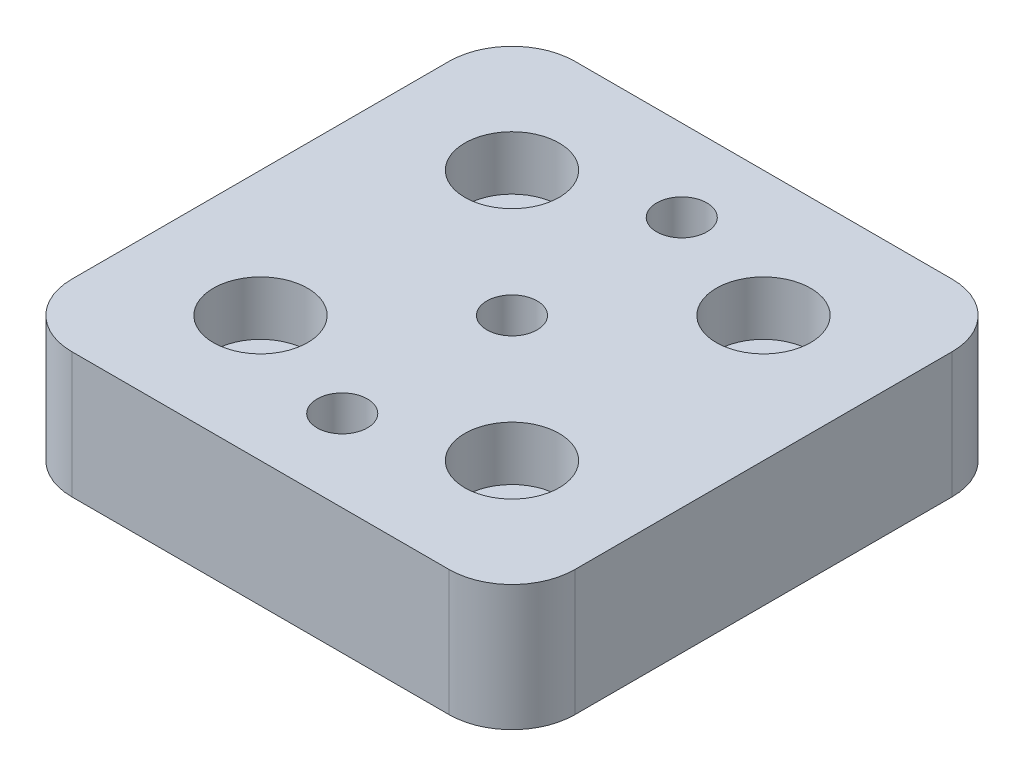
ISO-10303-21;
HEADER;
FILE_DESCRIPTION(('STEP AP214'),'2;1');
FILE_NAME('part.step','',(''),(''),'','','');
FILE_SCHEMA(('AUTOMOTIVE_DESIGN { 1 0 10303 214 1 1 1 1 }'));
ENDSEC;
DATA;
#1=APPLICATION_CONTEXT('core data for automotive mechanical design processes');
#2=APPLICATION_PROTOCOL_DEFINITION('international standard','automotive_design',2000,#1);
#3=PRODUCT_CONTEXT('',#1,'mechanical');
#4=PRODUCT('Part','Part','',(#3));
#5=PRODUCT_RELATED_PRODUCT_CATEGORY('part','',(#4));
#6=PRODUCT_DEFINITION_FORMATION('','',#4);
#7=PRODUCT_DEFINITION_CONTEXT('part definition',#1,'design');
#8=PRODUCT_DEFINITION('design','',#6,#7);
#9=PRODUCT_DEFINITION_SHAPE('','',#8);
#10=(LENGTH_UNIT() NAMED_UNIT(*) SI_UNIT(.MILLI.,.METRE.));
#11=(NAMED_UNIT(*) PLANE_ANGLE_UNIT() SI_UNIT($,.RADIAN.));
#12=(NAMED_UNIT(*) SI_UNIT($,.STERADIAN.) SOLID_ANGLE_UNIT());
#13=UNCERTAINTY_MEASURE_WITH_UNIT(LENGTH_MEASURE(1.E-05),#10,'distance_accuracy_value','');
#14=(GEOMETRIC_REPRESENTATION_CONTEXT(3) GLOBAL_UNCERTAINTY_ASSIGNED_CONTEXT((#13)) GLOBAL_UNIT_ASSIGNED_CONTEXT((#10,
#11,#12)) REPRESENTATION_CONTEXT('',''));
#15=CARTESIAN_POINT('',(0.,0.,0.));
#16=DIRECTION('',(0.,0.,1.));
#17=DIRECTION('',(1.,0.,0.));
#18=AXIS2_PLACEMENT_3D('',#15,#16,#17);
#19=CARTESIAN_POINT('',(40.,20.,40.));
#20=DIRECTION('',(-1.,0.,0.));
#21=DIRECTION('',(0.,0.,1.));
#22=AXIS2_PLACEMENT_3D('',#19,#20,#21);
#23=PLANE('',#22);
#24=DIRECTION('',(0.,0.,-1.));
#25=VECTOR('',#24,1.);
#26=CARTESIAN_POINT('',(40.,0.,40.));
#27=LINE('',#26,#25);
#28=CARTESIAN_POINT('',(40.,0.,30.));
#29=VERTEX_POINT('',#28);
#30=CARTESIAN_POINT('',(40.,0.,-30.));
#31=VERTEX_POINT('',#30);
#32=EDGE_CURVE('E136',#29,#31,#27,.T.);
#33=ORIENTED_EDGE('',*,*,#32,.T.);
#34=DIRECTION('',(0.,-1.,0.));
#35=VECTOR('',#34,1.);
#36=CARTESIAN_POINT('',(40.,20.,-30.));
#37=LINE('',#36,#35);
#38=CARTESIAN_POINT('',(40.,20.,-30.));
#39=VERTEX_POINT('',#38);
#40=EDGE_CURVE('E111',#31,#39,#37,.F.);
#41=ORIENTED_EDGE('',*,*,#40,.T.);
#42=DIRECTION('',(0.,0.,-1.));
#43=VECTOR('',#42,1.);
#44=CARTESIAN_POINT('',(40.,20.,40.));
#45=LINE('',#44,#43);
#46=CARTESIAN_POINT('',(40.,20.,30.));
#47=VERTEX_POINT('',#46);
#48=EDGE_CURVE('E149',#47,#39,#45,.T.);
#49=ORIENTED_EDGE('',*,*,#48,.F.);
#50=DIRECTION('',(0.,-1.,0.));
#51=VECTOR('',#50,1.);
#52=CARTESIAN_POINT('',(40.,20.,30.));
#53=LINE('',#52,#51);
#54=EDGE_CURVE('E117',#47,#29,#53,.T.);
#55=ORIENTED_EDGE('',*,*,#54,.T.);
#56=EDGE_LOOP('',(#33,#41,#49,#55));
#57=FACE_BOUND('',#56,.T.);
#58=ADVANCED_FACE('F39',(#57),#23,.F.);
#59=CARTESIAN_POINT('',(-40.,20.,-40.));
#60=DIRECTION('',(0.,0.,1.));
#61=DIRECTION('',(1.,0.,0.));
#62=AXIS2_PLACEMENT_3D('',#59,#60,#61);
#63=PLANE('',#62);
#64=DIRECTION('',(-1.,0.,0.));
#65=VECTOR('',#64,1.);
#66=CARTESIAN_POINT('',(-40.,20.,-40.));
#67=LINE('',#66,#65);
#68=CARTESIAN_POINT('',(30.,20.,-40.));
#69=VERTEX_POINT('',#68);
#70=CARTESIAN_POINT('',(-30.,20.,-40.));
#71=VERTEX_POINT('',#70);
#72=EDGE_CURVE('E127',#69,#71,#67,.T.);
#73=ORIENTED_EDGE('',*,*,#72,.F.);
#74=DIRECTION('',(0.,-1.,0.));
#75=VECTOR('',#74,1.);
#76=CARTESIAN_POINT('',(30.,20.,-40.));
#77=LINE('',#76,#75);
#78=CARTESIAN_POINT('',(30.,0.,-40.));
#79=VERTEX_POINT('',#78);
#80=EDGE_CURVE('E110',#69,#79,#77,.T.);
#81=ORIENTED_EDGE('',*,*,#80,.T.);
#82=DIRECTION('',(-1.,0.,0.));
#83=VECTOR('',#82,1.);
#84=CARTESIAN_POINT('',(-40.,0.,-40.));
#85=LINE('',#84,#83);
#86=CARTESIAN_POINT('',(-30.,0.,-40.));
#87=VERTEX_POINT('',#86);
#88=EDGE_CURVE('E124',#79,#87,#85,.T.);
#89=ORIENTED_EDGE('',*,*,#88,.T.);
#90=DIRECTION('',(0.,-1.,0.));
#91=VECTOR('',#90,1.);
#92=CARTESIAN_POINT('',(-30.,20.,-40.));
#93=LINE('',#92,#91);
#94=EDGE_CURVE('E130',#87,#71,#93,.F.);
#95=ORIENTED_EDGE('',*,*,#94,.T.);
#96=EDGE_LOOP('',(#73,#81,#89,#95));
#97=FACE_BOUND('',#96,.T.);
#98=ADVANCED_FACE('F123',(#97),#63,.F.);
#99=CARTESIAN_POINT('',(-40.,20.,40.));
#100=DIRECTION('',(1.,0.,0.));
#101=DIRECTION('',(0.,0.,-1.));
#102=AXIS2_PLACEMENT_3D('',#99,#100,#101);
#103=PLANE('',#102);
#104=DIRECTION('',(0.,0.,1.));
#105=VECTOR('',#104,1.);
#106=CARTESIAN_POINT('',(-40.,20.,40.));
#107=LINE('',#106,#105);
#108=CARTESIAN_POINT('',(-40.,20.,-30.));
#109=VERTEX_POINT('',#108);
#110=CARTESIAN_POINT('',(-40.,20.,30.));
#111=VERTEX_POINT('',#110);
#112=EDGE_CURVE('E185',#109,#111,#107,.T.);
#113=ORIENTED_EDGE('',*,*,#112,.F.);
#114=DIRECTION('',(0.,-1.,0.));
#115=VECTOR('',#114,1.);
#116=CARTESIAN_POINT('',(-40.,20.,-30.));
#117=LINE('',#116,#115);
#118=CARTESIAN_POINT('',(-40.,0.,-30.));
#119=VERTEX_POINT('',#118);
#120=EDGE_CURVE('E179',#109,#119,#117,.T.);
#121=ORIENTED_EDGE('',*,*,#120,.T.);
#122=DIRECTION('',(0.,0.,1.));
#123=VECTOR('',#122,1.);
#124=CARTESIAN_POINT('',(-40.,0.,40.));
#125=LINE('',#124,#123);
#126=CARTESIAN_POINT('',(-40.,0.,30.));
#127=VERTEX_POINT('',#126);
#128=EDGE_CURVE('E135',#119,#127,#125,.T.);
#129=ORIENTED_EDGE('',*,*,#128,.T.);
#130=DIRECTION('',(0.,-1.,0.));
#131=VECTOR('',#130,1.);
#132=CARTESIAN_POINT('',(-40.,20.,30.));
#133=LINE('',#132,#131);
#134=EDGE_CURVE('E176',#127,#111,#133,.F.);
#135=ORIENTED_EDGE('',*,*,#134,.T.);
#136=EDGE_LOOP('',(#113,#121,#129,#135));
#137=FACE_BOUND('',#136,.T.);
#138=ADVANCED_FACE('F324',(#137),#103,.F.);
#139=CARTESIAN_POINT('',(-40.,20.,40.));
#140=DIRECTION('',(0.,0.,-1.));
#141=DIRECTION('',(-1.,0.,0.));
#142=AXIS2_PLACEMENT_3D('',#139,#140,#141);
#143=PLANE('',#142);
#144=DIRECTION('',(1.,0.,0.));
#145=VECTOR('',#144,1.);
#146=CARTESIAN_POINT('',(-40.,20.,40.));
#147=LINE('',#146,#145);
#148=CARTESIAN_POINT('',(-30.,20.,40.));
#149=VERTEX_POINT('',#148);
#150=CARTESIAN_POINT('',(30.,20.,40.));
#151=VERTEX_POINT('',#150);
#152=EDGE_CURVE('E151',#149,#151,#147,.T.);
#153=ORIENTED_EDGE('',*,*,#152,.F.);
#154=DIRECTION('',(0.,-1.,0.));
#155=VECTOR('',#154,1.);
#156=CARTESIAN_POINT('',(-30.,20.,40.));
#157=LINE('',#156,#155);
#158=CARTESIAN_POINT('',(-30.,0.,40.));
#159=VERTEX_POINT('',#158);
#160=EDGE_CURVE('E11',#149,#159,#157,.T.);
#161=ORIENTED_EDGE('',*,*,#160,.T.);
#162=DIRECTION('',(1.,0.,0.));
#163=VECTOR('',#162,1.);
#164=CARTESIAN_POINT('',(-40.,0.,40.));
#165=LINE('',#164,#163);
#166=CARTESIAN_POINT('',(30.,0.,40.));
#167=VERTEX_POINT('',#166);
#168=EDGE_CURVE('E141',#159,#167,#165,.T.);
#169=ORIENTED_EDGE('',*,*,#168,.T.);
#170=DIRECTION('',(0.,-1.,0.));
#171=VECTOR('',#170,1.);
#172=CARTESIAN_POINT('',(30.,20.,40.));
#173=LINE('',#172,#171);
#174=EDGE_CURVE('E48',#167,#151,#173,.F.);
#175=ORIENTED_EDGE('',*,*,#174,.T.);
#176=EDGE_LOOP('',(#153,#161,#169,#175));
#177=FACE_BOUND('',#176,.T.);
#178=ADVANCED_FACE('F287',(#177),#143,.F.);
#179=CARTESIAN_POINT('',(0.,20.,0.));
#180=DIRECTION('',(0.,-1.,0.));
#181=DIRECTION('',(0.,0.,-1.));
#182=AXIS2_PLACEMENT_3D('',#179,#180,#181);
#183=PLANE('',#182);
#184=CARTESIAN_POINT('',(0.,20.,-27.));
#185=DIRECTION('',(0.,1.,0.));
#186=DIRECTION('',(0.,0.,1.));
#187=AXIS2_PLACEMENT_3D('',#184,#185,#186);
#188=CIRCLE('',#187,4.);
#189=CARTESIAN_POINT('',(0.,20.,-23.));
#190=VERTEX_POINT('',#189);
#191=EDGE_CURVE('E277',#190,#190,#188,.T.);
#192=ORIENTED_EDGE('',*,*,#191,.F.);
#193=EDGE_LOOP('',(#192));
#194=FACE_BOUND('',#193,.T.);
#195=CARTESIAN_POINT('',(0.,20.,0.));
#196=DIRECTION('',(0.,1.,0.));
#197=DIRECTION('',(0.,0.,1.));
#198=AXIS2_PLACEMENT_3D('',#195,#196,#197);
#199=CIRCLE('',#198,4.);
#200=CARTESIAN_POINT('',(0.,20.,4.));
#201=VERTEX_POINT('',#200);
#202=EDGE_CURVE('E269',#201,#201,#199,.T.);
#203=ORIENTED_EDGE('',*,*,#202,.F.);
#204=EDGE_LOOP('',(#203));
#205=FACE_BOUND('',#204,.T.);
#206=CARTESIAN_POINT('',(0.,20.,27.));
#207=DIRECTION('',(0.,1.,0.));
#208=DIRECTION('',(0.,0.,1.));
#209=AXIS2_PLACEMENT_3D('',#206,#207,#208);
#210=CIRCLE('',#209,4.);
#211=CARTESIAN_POINT('',(0.,20.,31.));
#212=VERTEX_POINT('',#211);
#213=EDGE_CURVE('E261',#212,#212,#210,.T.);
#214=ORIENTED_EDGE('',*,*,#213,.F.);
#215=EDGE_LOOP('',(#214));
#216=FACE_BOUND('',#215,.T.);
#217=CARTESIAN_POINT('',(-20.,20.,-20.));
#218=DIRECTION('',(0.,1.,0.));
#219=DIRECTION('',(0.,0.,1.));
#220=AXIS2_PLACEMENT_3D('',#217,#218,#219);
#221=CIRCLE('',#220,7.5);
#222=CARTESIAN_POINT('',(-20.,20.,-12.5));
#223=VERTEX_POINT('',#222);
#224=EDGE_CURVE('E253',#223,#223,#221,.T.);
#225=ORIENTED_EDGE('',*,*,#224,.F.);
#226=EDGE_LOOP('',(#225));
#227=FACE_BOUND('',#226,.T.);
#228=CARTESIAN_POINT('',(20.,20.,-20.));
#229=DIRECTION('',(0.,1.,0.));
#230=DIRECTION('',(0.,0.,1.));
#231=AXIS2_PLACEMENT_3D('',#228,#229,#230);
#232=CIRCLE('',#231,7.5);
#233=CARTESIAN_POINT('',(20.,20.,-12.5));
#234=VERTEX_POINT('',#233);
#235=EDGE_CURVE('E237',#234,#234,#232,.T.);
#236=ORIENTED_EDGE('',*,*,#235,.F.);
#237=EDGE_LOOP('',(#236));
#238=FACE_BOUND('',#237,.T.);
#239=CARTESIAN_POINT('',(20.,20.,20.));
#240=DIRECTION('',(0.,1.,0.));
#241=DIRECTION('',(0.,0.,1.));
#242=AXIS2_PLACEMENT_3D('',#239,#240,#241);
#243=CIRCLE('',#242,7.5);
#244=CARTESIAN_POINT('',(20.,20.,27.5));
#245=VERTEX_POINT('',#244);
#246=EDGE_CURVE('E221',#245,#245,#243,.T.);
#247=ORIENTED_EDGE('',*,*,#246,.F.);
#248=EDGE_LOOP('',(#247));
#249=FACE_BOUND('',#248,.T.);
#250=CARTESIAN_POINT('',(-20.,20.,20.));
#251=DIRECTION('',(0.,1.,0.));
#252=DIRECTION('',(0.,0.,1.));
#253=AXIS2_PLACEMENT_3D('',#250,#251,#252);
#254=CIRCLE('',#253,7.5);
#255=CARTESIAN_POINT('',(-20.,20.,27.5));
#256=VERTEX_POINT('',#255);
#257=EDGE_CURVE('E205',#256,#256,#254,.T.);
#258=ORIENTED_EDGE('',*,*,#257,.F.);
#259=EDGE_LOOP('',(#258));
#260=FACE_BOUND('',#259,.T.);
#261=ORIENTED_EDGE('',*,*,#48,.T.);
#262=CARTESIAN_POINT('',(30.,20.,-30.));
#263=DIRECTION('',(0.,-1.,0.));
#264=DIRECTION('',(0.,0.,-1.));
#265=AXIS2_PLACEMENT_3D('',#262,#263,#264);
#266=CIRCLE('',#265,10.);
#267=EDGE_CURVE('E173',#39,#69,#266,.F.);
#268=ORIENTED_EDGE('',*,*,#267,.T.);
#269=ORIENTED_EDGE('',*,*,#72,.T.);
#270=CARTESIAN_POINT('',(-30.,20.,-30.));
#271=DIRECTION('',(0.,-1.,0.));
#272=DIRECTION('',(0.,0.,-1.));
#273=AXIS2_PLACEMENT_3D('',#270,#271,#272);
#274=CIRCLE('',#273,10.);
#275=EDGE_CURVE('E170',#71,#109,#274,.F.);
#276=ORIENTED_EDGE('',*,*,#275,.T.);
#277=ORIENTED_EDGE('',*,*,#112,.T.);
#278=CARTESIAN_POINT('',(-30.,20.,30.));
#279=DIRECTION('',(0.,-1.,0.));
#280=DIRECTION('',(0.,0.,-1.));
#281=AXIS2_PLACEMENT_3D('',#278,#279,#280);
#282=CIRCLE('',#281,10.);
#283=EDGE_CURVE('E61',#111,#149,#282,.F.);
#284=ORIENTED_EDGE('',*,*,#283,.T.);
#285=ORIENTED_EDGE('',*,*,#152,.T.);
#286=CARTESIAN_POINT('',(30.,20.,30.));
#287=DIRECTION('',(0.,-1.,0.));
#288=DIRECTION('',(0.,0.,-1.));
#289=AXIS2_PLACEMENT_3D('',#286,#287,#288);
#290=CIRCLE('',#289,10.);
#291=EDGE_CURVE('E165',#151,#47,#290,.F.);
#292=ORIENTED_EDGE('',*,*,#291,.T.);
#293=EDGE_LOOP('',(#261,#268,#269,#276,#277,#284,#285,#292));
#294=FACE_BOUND('',#293,.T.);
#295=ADVANCED_FACE('F284',(#194,#205,#216,#227,#238,#249,#260,#294),#183,.F.);
#296=CARTESIAN_POINT('',(0.,0.,0.));
#297=DIRECTION('',(0.,-1.,0.));
#298=DIRECTION('',(0.,0.,-1.));
#299=AXIS2_PLACEMENT_3D('',#296,#297,#298);
#300=PLANE('',#299);
#301=CARTESIAN_POINT('',(0.,0.,-27.));
#302=DIRECTION('',(0.,1.,0.));
#303=DIRECTION('',(0.,0.,1.));
#304=AXIS2_PLACEMENT_3D('',#301,#302,#303);
#305=CIRCLE('',#304,4.);
#306=CARTESIAN_POINT('',(0.,0.,-23.));
#307=VERTEX_POINT('',#306);
#308=EDGE_CURVE('E273',#307,#307,#305,.T.);
#309=ORIENTED_EDGE('',*,*,#308,.T.);
#310=EDGE_LOOP('',(#309));
#311=FACE_BOUND('',#310,.T.);
#312=CARTESIAN_POINT('',(0.,0.,0.));
#313=DIRECTION('',(0.,1.,0.));
#314=DIRECTION('',(0.,0.,1.));
#315=AXIS2_PLACEMENT_3D('',#312,#313,#314);
#316=CIRCLE('',#315,4.);
#317=CARTESIAN_POINT('',(0.,0.,4.));
#318=VERTEX_POINT('',#317);
#319=EDGE_CURVE('E265',#318,#318,#316,.T.);
#320=ORIENTED_EDGE('',*,*,#319,.T.);
#321=EDGE_LOOP('',(#320));
#322=FACE_BOUND('',#321,.T.);
#323=CARTESIAN_POINT('',(0.,0.,27.));
#324=DIRECTION('',(0.,1.,0.));
#325=DIRECTION('',(0.,0.,1.));
#326=AXIS2_PLACEMENT_3D('',#323,#324,#325);
#327=CIRCLE('',#326,4.);
#328=CARTESIAN_POINT('',(0.,0.,31.));
#329=VERTEX_POINT('',#328);
#330=EDGE_CURVE('E257',#329,#329,#327,.T.);
#331=ORIENTED_EDGE('',*,*,#330,.T.);
#332=EDGE_LOOP('',(#331));
#333=FACE_BOUND('',#332,.T.);
#334=CARTESIAN_POINT('',(-20.,0.,-20.));
#335=DIRECTION('',(0.,1.,0.));
#336=DIRECTION('',(0.,0.,1.));
#337=AXIS2_PLACEMENT_3D('',#334,#335,#336);
#338=CIRCLE('',#337,4.5);
#339=CARTESIAN_POINT('',(-20.,0.,-15.5));
#340=VERTEX_POINT('',#339);
#341=EDGE_CURVE('E241',#340,#340,#338,.T.);
#342=ORIENTED_EDGE('',*,*,#341,.T.);
#343=EDGE_LOOP('',(#342));
#344=FACE_BOUND('',#343,.T.);
#345=CARTESIAN_POINT('',(20.,0.,-20.));
#346=DIRECTION('',(0.,1.,0.));
#347=DIRECTION('',(0.,0.,1.));
#348=AXIS2_PLACEMENT_3D('',#345,#346,#347);
#349=CIRCLE('',#348,4.5);
#350=CARTESIAN_POINT('',(20.,0.,-15.5));
#351=VERTEX_POINT('',#350);
#352=EDGE_CURVE('E225',#351,#351,#349,.T.);
#353=ORIENTED_EDGE('',*,*,#352,.T.);
#354=EDGE_LOOP('',(#353));
#355=FACE_BOUND('',#354,.T.);
#356=CARTESIAN_POINT('',(20.,0.,20.));
#357=DIRECTION('',(0.,1.,0.));
#358=DIRECTION('',(0.,0.,1.));
#359=AXIS2_PLACEMENT_3D('',#356,#357,#358);
#360=CIRCLE('',#359,4.5);
#361=CARTESIAN_POINT('',(20.,0.,24.5));
#362=VERTEX_POINT('',#361);
#363=EDGE_CURVE('E209',#362,#362,#360,.T.);
#364=ORIENTED_EDGE('',*,*,#363,.T.);
#365=EDGE_LOOP('',(#364));
#366=FACE_BOUND('',#365,.T.);
#367=CARTESIAN_POINT('',(-20.,0.,20.));
#368=DIRECTION('',(0.,1.,0.));
#369=DIRECTION('',(0.,0.,1.));
#370=AXIS2_PLACEMENT_3D('',#367,#368,#369);
#371=CIRCLE('',#370,4.5);
#372=CARTESIAN_POINT('',(-20.,0.,24.5));
#373=VERTEX_POINT('',#372);
#374=EDGE_CURVE('E143',#373,#373,#371,.T.);
#375=ORIENTED_EDGE('',*,*,#374,.T.);
#376=EDGE_LOOP('',(#375));
#377=FACE_BOUND('',#376,.T.);
#378=ORIENTED_EDGE('',*,*,#88,.F.);
#379=CARTESIAN_POINT('',(30.,0.,-30.));
#380=DIRECTION('',(0.,-1.,0.));
#381=DIRECTION('',(0.,0.,-1.));
#382=AXIS2_PLACEMENT_3D('',#379,#380,#381);
#383=CIRCLE('',#382,10.);
#384=EDGE_CURVE('E106',#79,#31,#383,.T.);
#385=ORIENTED_EDGE('',*,*,#384,.T.);
#386=ORIENTED_EDGE('',*,*,#32,.F.);
#387=CARTESIAN_POINT('',(30.,0.,30.));
#388=DIRECTION('',(0.,-1.,0.));
#389=DIRECTION('',(0.,0.,-1.));
#390=AXIS2_PLACEMENT_3D('',#387,#388,#389);
#391=CIRCLE('',#390,10.);
#392=EDGE_CURVE('E129',#29,#167,#391,.T.);
#393=ORIENTED_EDGE('',*,*,#392,.T.);
#394=ORIENTED_EDGE('',*,*,#168,.F.);
#395=CARTESIAN_POINT('',(-30.,0.,30.));
#396=DIRECTION('',(0.,-1.,0.));
#397=DIRECTION('',(0.,0.,-1.));
#398=AXIS2_PLACEMENT_3D('',#395,#396,#397);
#399=CIRCLE('',#398,10.);
#400=EDGE_CURVE('E155',#159,#127,#399,.T.);
#401=ORIENTED_EDGE('',*,*,#400,.T.);
#402=ORIENTED_EDGE('',*,*,#128,.F.);
#403=CARTESIAN_POINT('',(-30.,0.,-30.));
#404=DIRECTION('',(0.,-1.,0.));
#405=DIRECTION('',(0.,0.,-1.));
#406=AXIS2_PLACEMENT_3D('',#403,#404,#405);
#407=CIRCLE('',#406,10.);
#408=EDGE_CURVE('E118',#119,#87,#407,.T.);
#409=ORIENTED_EDGE('',*,*,#408,.T.);
#410=EDGE_LOOP('',(#378,#385,#386,#393,#394,#401,#402,#409));
#411=FACE_BOUND('',#410,.T.);
#412=ADVANCED_FACE('F132',(#311,#322,#333,#344,#355,#366,#377,#411),#300,.T.);
#413=CARTESIAN_POINT('',(-20.,20.,20.));
#414=DIRECTION('',(0.,1.,0.));
#415=DIRECTION('',(0.,0.,1.));
#416=AXIS2_PLACEMENT_3D('',#413,#414,#415);
#417=CYLINDRICAL_SURFACE('',#416,4.5);
#418=ORIENTED_EDGE('',*,*,#374,.F.);
#419=EDGE_LOOP('',(#418));
#420=FACE_BOUND('',#419,.T.);
#421=CARTESIAN_POINT('',(-20.,11.4,20.));
#422=DIRECTION('',(0.,1.,0.));
#423=DIRECTION('',(0.,0.,1.));
#424=AXIS2_PLACEMENT_3D('',#421,#422,#423);
#425=CIRCLE('',#424,4.5);
#426=CARTESIAN_POINT('',(-20.,11.4,24.5));
#427=VERTEX_POINT('',#426);
#428=EDGE_CURVE('E197',#427,#427,#425,.T.);
#429=ORIENTED_EDGE('',*,*,#428,.T.);
#430=EDGE_LOOP('',(#429));
#431=FACE_BOUND('',#430,.T.);
#432=ADVANCED_FACE('F314',(#420,#431),#417,.F.);
#433=CARTESIAN_POINT('',(-15.5,11.4,20.));
#434=DIRECTION('',(0.,-1.,0.));
#435=DIRECTION('',(0.,0.,-1.));
#436=AXIS2_PLACEMENT_3D('',#433,#434,#435);
#437=PLANE('',#436);
#438=ORIENTED_EDGE('',*,*,#428,.F.);
#439=EDGE_LOOP('',(#438));
#440=FACE_BOUND('',#439,.T.);
#441=CARTESIAN_POINT('',(-20.,11.4,20.));
#442=DIRECTION('',(0.,1.,0.));
#443=DIRECTION('',(0.,0.,1.));
#444=AXIS2_PLACEMENT_3D('',#441,#442,#443);
#445=CIRCLE('',#444,7.5);
#446=CARTESIAN_POINT('',(-20.,11.4,27.5));
#447=VERTEX_POINT('',#446);
#448=EDGE_CURVE('E201',#447,#447,#445,.T.);
#449=ORIENTED_EDGE('',*,*,#448,.T.);
#450=EDGE_LOOP('',(#449));
#451=FACE_BOUND('',#450,.T.);
#452=ADVANCED_FACE('F304',(#440,#451),#437,.F.);
#453=CARTESIAN_POINT('',(-20.,20.,20.));
#454=DIRECTION('',(0.,1.,0.));
#455=DIRECTION('',(0.,0.,1.));
#456=AXIS2_PLACEMENT_3D('',#453,#454,#455);
#457=CYLINDRICAL_SURFACE('',#456,7.5);
#458=ORIENTED_EDGE('',*,*,#448,.F.);
#459=EDGE_LOOP('',(#458));
#460=FACE_BOUND('',#459,.T.);
#461=ORIENTED_EDGE('',*,*,#257,.T.);
#462=EDGE_LOOP('',(#461));
#463=FACE_BOUND('',#462,.T.);
#464=ADVANCED_FACE('F301',(#460,#463),#457,.F.);
#465=CARTESIAN_POINT('',(20.,20.,20.));
#466=DIRECTION('',(0.,1.,0.));
#467=DIRECTION('',(0.,0.,1.));
#468=AXIS2_PLACEMENT_3D('',#465,#466,#467);
#469=CYLINDRICAL_SURFACE('',#468,4.5);
#470=ORIENTED_EDGE('',*,*,#363,.F.);
#471=EDGE_LOOP('',(#470));
#472=FACE_BOUND('',#471,.T.);
#473=CARTESIAN_POINT('',(20.,11.4,20.));
#474=DIRECTION('',(0.,1.,0.));
#475=DIRECTION('',(0.,0.,1.));
#476=AXIS2_PLACEMENT_3D('',#473,#474,#475);
#477=CIRCLE('',#476,4.5);
#478=CARTESIAN_POINT('',(20.,11.4,24.5));
#479=VERTEX_POINT('',#478);
#480=EDGE_CURVE('E213',#479,#479,#477,.T.);
#481=ORIENTED_EDGE('',*,*,#480,.T.);
#482=EDGE_LOOP('',(#481));
#483=FACE_BOUND('',#482,.T.);
#484=ADVANCED_FACE('F303',(#472,#483),#469,.F.);
#485=CARTESIAN_POINT('',(24.5,11.4,20.));
#486=DIRECTION('',(0.,-1.,0.));
#487=DIRECTION('',(0.,0.,-1.));
#488=AXIS2_PLACEMENT_3D('',#485,#486,#487);
#489=PLANE('',#488);
#490=ORIENTED_EDGE('',*,*,#480,.F.);
#491=EDGE_LOOP('',(#490));
#492=FACE_BOUND('',#491,.T.);
#493=CARTESIAN_POINT('',(20.,11.4,20.));
#494=DIRECTION('',(0.,1.,0.));
#495=DIRECTION('',(0.,0.,1.));
#496=AXIS2_PLACEMENT_3D('',#493,#494,#495);
#497=CIRCLE('',#496,7.5);
#498=CARTESIAN_POINT('',(20.,11.4,27.5));
#499=VERTEX_POINT('',#498);
#500=EDGE_CURVE('E217',#499,#499,#497,.T.);
#501=ORIENTED_EDGE('',*,*,#500,.T.);
#502=EDGE_LOOP('',(#501));
#503=FACE_BOUND('',#502,.T.);
#504=ADVANCED_FACE('F311',(#492,#503),#489,.F.);
#505=CARTESIAN_POINT('',(20.,20.,20.));
#506=DIRECTION('',(0.,1.,0.));
#507=DIRECTION('',(0.,0.,1.));
#508=AXIS2_PLACEMENT_3D('',#505,#506,#507);
#509=CYLINDRICAL_SURFACE('',#508,7.5);
#510=ORIENTED_EDGE('',*,*,#500,.F.);
#511=EDGE_LOOP('',(#510));
#512=FACE_BOUND('',#511,.T.);
#513=ORIENTED_EDGE('',*,*,#246,.T.);
#514=EDGE_LOOP('',(#513));
#515=FACE_BOUND('',#514,.T.);
#516=ADVANCED_FACE('F392',(#512,#515),#509,.F.);
#517=CARTESIAN_POINT('',(20.,20.,-20.));
#518=DIRECTION('',(0.,1.,0.));
#519=DIRECTION('',(0.,0.,1.));
#520=AXIS2_PLACEMENT_3D('',#517,#518,#519);
#521=CYLINDRICAL_SURFACE('',#520,4.5);
#522=ORIENTED_EDGE('',*,*,#352,.F.);
#523=EDGE_LOOP('',(#522));
#524=FACE_BOUND('',#523,.T.);
#525=CARTESIAN_POINT('',(20.,11.4,-20.));
#526=DIRECTION('',(0.,1.,0.));
#527=DIRECTION('',(0.,0.,1.));
#528=AXIS2_PLACEMENT_3D('',#525,#526,#527);
#529=CIRCLE('',#528,4.5);
#530=CARTESIAN_POINT('',(20.,11.4,-15.5));
#531=VERTEX_POINT('',#530);
#532=EDGE_CURVE('E229',#531,#531,#529,.T.);
#533=ORIENTED_EDGE('',*,*,#532,.T.);
#534=EDGE_LOOP('',(#533));
#535=FACE_BOUND('',#534,.T.);
#536=ADVANCED_FACE('F402',(#524,#535),#521,.F.);
#537=CARTESIAN_POINT('',(24.5,11.4,-20.));
#538=DIRECTION('',(0.,-1.,0.));
#539=DIRECTION('',(0.,0.,-1.));
#540=AXIS2_PLACEMENT_3D('',#537,#538,#539);
#541=PLANE('',#540);
#542=ORIENTED_EDGE('',*,*,#532,.F.);
#543=EDGE_LOOP('',(#542));
#544=FACE_BOUND('',#543,.T.);
#545=CARTESIAN_POINT('',(20.,11.4,-20.));
#546=DIRECTION('',(0.,1.,0.));
#547=DIRECTION('',(0.,0.,1.));
#548=AXIS2_PLACEMENT_3D('',#545,#546,#547);
#549=CIRCLE('',#548,7.5);
#550=CARTESIAN_POINT('',(20.,11.4,-12.5));
#551=VERTEX_POINT('',#550);
#552=EDGE_CURVE('E233',#551,#551,#549,.T.);
#553=ORIENTED_EDGE('',*,*,#552,.T.);
#554=EDGE_LOOP('',(#553));
#555=FACE_BOUND('',#554,.T.);
#556=ADVANCED_FACE('F412',(#544,#555),#541,.F.);
#557=CARTESIAN_POINT('',(20.,20.,-20.));
#558=DIRECTION('',(0.,1.,0.));
#559=DIRECTION('',(0.,0.,1.));
#560=AXIS2_PLACEMENT_3D('',#557,#558,#559);
#561=CYLINDRICAL_SURFACE('',#560,7.5);
#562=ORIENTED_EDGE('',*,*,#552,.F.);
#563=EDGE_LOOP('',(#562));
#564=FACE_BOUND('',#563,.T.);
#565=ORIENTED_EDGE('',*,*,#235,.T.);
#566=EDGE_LOOP('',(#565));
#567=FACE_BOUND('',#566,.T.);
#568=ADVANCED_FACE('F422',(#564,#567),#561,.F.);
#569=CARTESIAN_POINT('',(-20.,20.,-20.));
#570=DIRECTION('',(0.,1.,0.));
#571=DIRECTION('',(0.,0.,1.));
#572=AXIS2_PLACEMENT_3D('',#569,#570,#571);
#573=CYLINDRICAL_SURFACE('',#572,4.5);
#574=ORIENTED_EDGE('',*,*,#341,.F.);
#575=EDGE_LOOP('',(#574));
#576=FACE_BOUND('',#575,.T.);
#577=CARTESIAN_POINT('',(-20.,11.4,-20.));
#578=DIRECTION('',(0.,1.,0.));
#579=DIRECTION('',(0.,0.,1.));
#580=AXIS2_PLACEMENT_3D('',#577,#578,#579);
#581=CIRCLE('',#580,4.5);
#582=CARTESIAN_POINT('',(-20.,11.4,-15.5));
#583=VERTEX_POINT('',#582);
#584=EDGE_CURVE('E245',#583,#583,#581,.T.);
#585=ORIENTED_EDGE('',*,*,#584,.T.);
#586=EDGE_LOOP('',(#585));
#587=FACE_BOUND('',#586,.T.);
#588=ADVANCED_FACE('F432',(#576,#587),#573,.F.);
#589=CARTESIAN_POINT('',(-15.5,11.4,-20.));
#590=DIRECTION('',(0.,-1.,0.));
#591=DIRECTION('',(0.,0.,-1.));
#592=AXIS2_PLACEMENT_3D('',#589,#590,#591);
#593=PLANE('',#592);
#594=ORIENTED_EDGE('',*,*,#584,.F.);
#595=EDGE_LOOP('',(#594));
#596=FACE_BOUND('',#595,.T.);
#597=CARTESIAN_POINT('',(-20.,11.4,-20.));
#598=DIRECTION('',(0.,1.,0.));
#599=DIRECTION('',(0.,0.,1.));
#600=AXIS2_PLACEMENT_3D('',#597,#598,#599);
#601=CIRCLE('',#600,7.5);
#602=CARTESIAN_POINT('',(-20.,11.4,-12.5));
#603=VERTEX_POINT('',#602);
#604=EDGE_CURVE('E249',#603,#603,#601,.T.);
#605=ORIENTED_EDGE('',*,*,#604,.T.);
#606=EDGE_LOOP('',(#605));
#607=FACE_BOUND('',#606,.T.);
#608=ADVANCED_FACE('F442',(#596,#607),#593,.F.);
#609=CARTESIAN_POINT('',(-20.,20.,-20.));
#610=DIRECTION('',(0.,1.,0.));
#611=DIRECTION('',(0.,0.,1.));
#612=AXIS2_PLACEMENT_3D('',#609,#610,#611);
#613=CYLINDRICAL_SURFACE('',#612,7.5);
#614=ORIENTED_EDGE('',*,*,#604,.F.);
#615=EDGE_LOOP('',(#614));
#616=FACE_BOUND('',#615,.T.);
#617=ORIENTED_EDGE('',*,*,#224,.T.);
#618=EDGE_LOOP('',(#617));
#619=FACE_BOUND('',#618,.T.);
#620=ADVANCED_FACE('F452',(#616,#619),#613,.F.);
#621=CARTESIAN_POINT('',(0.,20.,27.));
#622=DIRECTION('',(0.,1.,0.));
#623=DIRECTION('',(0.,0.,1.));
#624=AXIS2_PLACEMENT_3D('',#621,#622,#623);
#625=CYLINDRICAL_SURFACE('',#624,4.);
#626=ORIENTED_EDGE('',*,*,#330,.F.);
#627=EDGE_LOOP('',(#626));
#628=FACE_BOUND('',#627,.T.);
#629=ORIENTED_EDGE('',*,*,#213,.T.);
#630=EDGE_LOOP('',(#629));
#631=FACE_BOUND('',#630,.T.);
#632=ADVANCED_FACE('F462',(#628,#631),#625,.F.);
#633=CARTESIAN_POINT('',(0.,20.,0.));
#634=DIRECTION('',(0.,1.,0.));
#635=DIRECTION('',(0.,0.,1.));
#636=AXIS2_PLACEMENT_3D('',#633,#634,#635);
#637=CYLINDRICAL_SURFACE('',#636,4.);
#638=ORIENTED_EDGE('',*,*,#319,.F.);
#639=EDGE_LOOP('',(#638));
#640=FACE_BOUND('',#639,.T.);
#641=ORIENTED_EDGE('',*,*,#202,.T.);
#642=EDGE_LOOP('',(#641));
#643=FACE_BOUND('',#642,.T.);
#644=ADVANCED_FACE('F472',(#640,#643),#637,.F.);
#645=CARTESIAN_POINT('',(0.,20.,-27.));
#646=DIRECTION('',(0.,1.,0.));
#647=DIRECTION('',(0.,0.,1.));
#648=AXIS2_PLACEMENT_3D('',#645,#646,#647);
#649=CYLINDRICAL_SURFACE('',#648,4.);
#650=ORIENTED_EDGE('',*,*,#308,.F.);
#651=EDGE_LOOP('',(#650));
#652=FACE_BOUND('',#651,.T.);
#653=ORIENTED_EDGE('',*,*,#191,.T.);
#654=EDGE_LOOP('',(#653));
#655=FACE_BOUND('',#654,.T.);
#656=ADVANCED_FACE('F282',(#652,#655),#649,.F.);
#657=CARTESIAN_POINT('',(30.,20.,-30.));
#658=DIRECTION('',(0.,-1.,0.));
#659=DIRECTION('',(0.,0.,-1.));
#660=AXIS2_PLACEMENT_3D('',#657,#658,#659);
#661=CYLINDRICAL_SURFACE('',#660,10.);
#662=ORIENTED_EDGE('',*,*,#267,.F.);
#663=ORIENTED_EDGE('',*,*,#40,.F.);
#664=ORIENTED_EDGE('',*,*,#384,.F.);
#665=ORIENTED_EDGE('',*,*,#80,.F.);
#666=EDGE_LOOP('',(#662,#663,#664,#665));
#667=FACE_BOUND('',#666,.T.);
#668=ADVANCED_FACE('F109',(#667),#661,.T.);
#669=CARTESIAN_POINT('',(-30.,20.,-30.));
#670=DIRECTION('',(0.,-1.,0.));
#671=DIRECTION('',(0.,0.,-1.));
#672=AXIS2_PLACEMENT_3D('',#669,#670,#671);
#673=CYLINDRICAL_SURFACE('',#672,10.);
#674=ORIENTED_EDGE('',*,*,#275,.F.);
#675=ORIENTED_EDGE('',*,*,#94,.F.);
#676=ORIENTED_EDGE('',*,*,#408,.F.);
#677=ORIENTED_EDGE('',*,*,#120,.F.);
#678=EDGE_LOOP('',(#674,#675,#676,#677));
#679=FACE_BOUND('',#678,.T.);
#680=ADVANCED_FACE('F330',(#679),#673,.T.);
#681=CARTESIAN_POINT('',(-30.,20.,30.));
#682=DIRECTION('',(0.,-1.,0.));
#683=DIRECTION('',(0.,0.,-1.));
#684=AXIS2_PLACEMENT_3D('',#681,#682,#683);
#685=CYLINDRICAL_SURFACE('',#684,10.);
#686=ORIENTED_EDGE('',*,*,#283,.F.);
#687=ORIENTED_EDGE('',*,*,#134,.F.);
#688=ORIENTED_EDGE('',*,*,#400,.F.);
#689=ORIENTED_EDGE('',*,*,#160,.F.);
#690=EDGE_LOOP('',(#686,#687,#688,#689));
#691=FACE_BOUND('',#690,.T.);
#692=ADVANCED_FACE('F332',(#691),#685,.T.);
#693=CARTESIAN_POINT('',(30.,20.,30.));
#694=DIRECTION('',(0.,-1.,0.));
#695=DIRECTION('',(0.,0.,-1.));
#696=AXIS2_PLACEMENT_3D('',#693,#694,#695);
#697=CYLINDRICAL_SURFACE('',#696,10.);
#698=ORIENTED_EDGE('',*,*,#291,.F.);
#699=ORIENTED_EDGE('',*,*,#174,.F.);
#700=ORIENTED_EDGE('',*,*,#392,.F.);
#701=ORIENTED_EDGE('',*,*,#54,.F.);
#702=EDGE_LOOP('',(#698,#699,#700,#701));
#703=FACE_BOUND('',#702,.T.);
#704=ADVANCED_FACE('F41',(#703),#697,.T.);
#705=CLOSED_SHELL('',(#58,#98,#138,#178,#295,#412,#432,#452,#464,#484,#504,#516,#536,#556,#568,
#588,#608,#620,#632,#644,#656,#668,#680,#692,#704));
#706=MANIFOLD_SOLID_BREP('B2',#705);
#707=ADVANCED_BREP_SHAPE_REPRESENTATION('',(#18,#706),#14);
#708=SHAPE_DEFINITION_REPRESENTATION(#9,#707);
ENDSEC;
END-ISO-10303-21;
